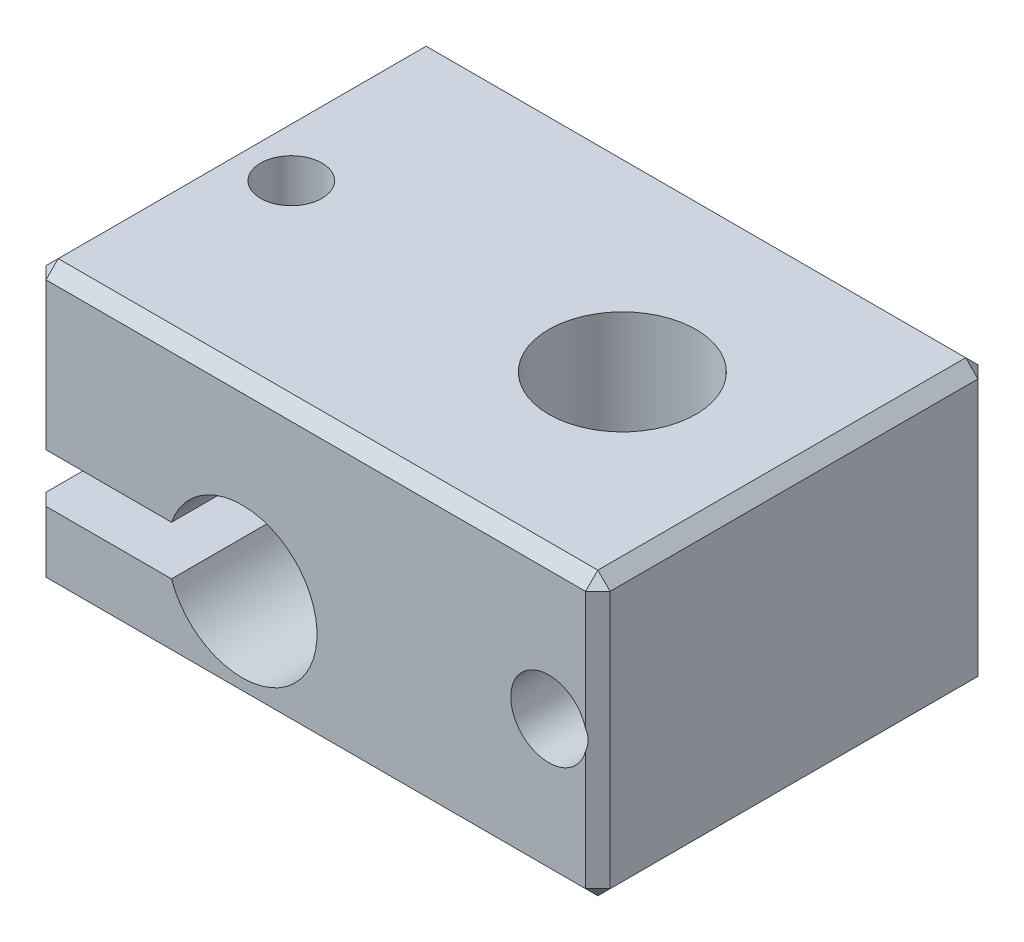
ISO-10303-21;
HEADER;
FILE_DESCRIPTION(('STEP AP214'),'2;1');
FILE_NAME('part.step','',(''),(''),'','','');
FILE_SCHEMA(('AUTOMOTIVE_DESIGN { 1 0 10303 214 1 1 1 1 }'));
ENDSEC;
DATA;
#1=APPLICATION_CONTEXT('core data for automotive mechanical design processes');
#2=APPLICATION_PROTOCOL_DEFINITION('international standard','automotive_design',2000,#1);
#3=PRODUCT_CONTEXT('',#1,'mechanical');
#4=PRODUCT('Part','Part','',(#3));
#5=PRODUCT_RELATED_PRODUCT_CATEGORY('part','',(#4));
#6=PRODUCT_DEFINITION_FORMATION('','',#4);
#7=PRODUCT_DEFINITION_CONTEXT('part definition',#1,'design');
#8=PRODUCT_DEFINITION('design','',#6,#7);
#9=PRODUCT_DEFINITION_SHAPE('','',#8);
#10=(LENGTH_UNIT() NAMED_UNIT(*) SI_UNIT(.MILLI.,.METRE.));
#11=(NAMED_UNIT(*) PLANE_ANGLE_UNIT() SI_UNIT($,.RADIAN.));
#12=(NAMED_UNIT(*) SI_UNIT($,.STERADIAN.) SOLID_ANGLE_UNIT());
#13=UNCERTAINTY_MEASURE_WITH_UNIT(LENGTH_MEASURE(1.E-05),#10,'distance_accuracy_value','');
#14=(GEOMETRIC_REPRESENTATION_CONTEXT(3) GLOBAL_UNCERTAINTY_ASSIGNED_CONTEXT((#13)) GLOBAL_UNIT_ASSIGNED_CONTEXT((#10,
#11,#12)) REPRESENTATION_CONTEXT('',''));
#15=CARTESIAN_POINT('',(0.,0.,0.));
#16=DIRECTION('',(0.,0.,1.));
#17=DIRECTION('',(1.,0.,0.));
#18=AXIS2_PLACEMENT_3D('',#15,#16,#17);
#19=CARTESIAN_POINT('',(-11.5,-5.75,8.));
#20=DIRECTION('',(0.,1.,0.));
#21=DIRECTION('',(0.,0.,1.));
#22=AXIS2_PLACEMENT_3D('',#19,#20,#21);
#23=PLANE('',#22);
#24=CARTESIAN_POINT('',(4.5,-5.75,0.));
#25=DIRECTION('',(0.,1.,0.));
#26=DIRECTION('',(0.,0.,1.));
#27=AXIS2_PLACEMENT_3D('',#24,#25,#26);
#28=CIRCLE('',#27,2.99999999999999);
#29=CARTESIAN_POINT('',(4.5,-5.75,2.99999999999999));
#30=VERTEX_POINT('',#29);
#31=EDGE_CURVE('E486',#30,#30,#28,.T.);
#32=ORIENTED_EDGE('',*,*,#31,.T.);
#33=EDGE_LOOP('',(#32));
#34=FACE_BOUND('',#33,.T.);
#35=CARTESIAN_POINT('',(-9.00000000000001,-5.75,0.));
#36=DIRECTION('',(0.,1.,0.));
#37=DIRECTION('',(0.,0.,1.));
#38=AXIS2_PLACEMENT_3D('',#35,#36,#37);
#39=CIRCLE('',#38,1.25);
#40=CARTESIAN_POINT('',(-9.00000000000001,-5.75,1.25));
#41=VERTEX_POINT('',#40);
#42=EDGE_CURVE('E491',#41,#41,#39,.T.);
#43=ORIENTED_EDGE('',*,*,#42,.T.);
#44=EDGE_LOOP('',(#43));
#45=FACE_BOUND('',#44,.T.);
#46=DIRECTION('',(0.,0.,-1.));
#47=VECTOR('',#46,1.);
#48=CARTESIAN_POINT('',(-11.,-5.75,8.));
#49=LINE('',#48,#47);
#50=CARTESIAN_POINT('',(-11.,-5.75,7.5));
#51=VERTEX_POINT('',#50);
#52=CARTESIAN_POINT('',(-11.,-5.75,-7.5));
#53=VERTEX_POINT('',#52);
#54=EDGE_CURVE('E347',#51,#53,#49,.T.);
#55=ORIENTED_EDGE('',*,*,#54,.T.);
#56=DIRECTION('',(1.,0.,0.));
#57=VECTOR('',#56,1.);
#58=CARTESIAN_POINT('',(11.5,-5.75,-7.5));
#59=LINE('',#58,#57);
#60=CARTESIAN_POINT('',(11.,-5.75,-7.5));
#61=VERTEX_POINT('',#60);
#62=EDGE_CURVE('E188',#53,#61,#59,.T.);
#63=ORIENTED_EDGE('',*,*,#62,.T.);
#64=DIRECTION('',(0.,0.,1.));
#65=VECTOR('',#64,1.);
#66=CARTESIAN_POINT('',(11.,-5.75,8.));
#67=LINE('',#66,#65);
#68=CARTESIAN_POINT('',(11.,-5.75,7.5));
#69=VERTEX_POINT('',#68);
#70=EDGE_CURVE('E343',#61,#69,#67,.T.);
#71=ORIENTED_EDGE('',*,*,#70,.T.);
#72=DIRECTION('',(-1.,0.,0.));
#73=VECTOR('',#72,1.);
#74=CARTESIAN_POINT('',(-11.5,-5.75,7.5));
#75=LINE('',#74,#73);
#76=EDGE_CURVE('E345',#69,#51,#75,.T.);
#77=ORIENTED_EDGE('',*,*,#76,.T.);
#78=EDGE_LOOP('',(#55,#63,#71,#77));
#79=FACE_BOUND('',#78,.T.);
#80=CARTESIAN_POINT('',(9.5,-5.75,0.));
#81=DIRECTION('',(0.,-1.,0.));
#82=DIRECTION('',(0.,0.,-1.));
#83=AXIS2_PLACEMENT_3D('',#80,#81,#82);
#84=CIRCLE('',#83,1.25);
#85=CARTESIAN_POINT('',(9.5,-5.75,-1.25));
#86=VERTEX_POINT('',#85);
#87=EDGE_CURVE('E480',#86,#86,#84,.T.);
#88=ORIENTED_EDGE('',*,*,#87,.F.);
#89=EDGE_LOOP('',(#88));
#90=FACE_BOUND('',#89,.T.);
#91=ADVANCED_FACE('F35',(#34,#45,#79,#90),#23,.F.);
#92=CARTESIAN_POINT('',(-3.,-1.75,8.));
#93=DIRECTION('',(0.,0.,-1.));
#94=DIRECTION('',(-1.,0.,0.));
#95=AXIS2_PLACEMENT_3D('',#92,#93,#94);
#96=PLANE('',#95);
#97=CARTESIAN_POINT('',(9.5,0.,8.));
#98=DIRECTION('',(0.,0.,1.));
#99=DIRECTION('',(1.,0.,0.));
#100=AXIS2_PLACEMENT_3D('',#97,#98,#99);
#101=CIRCLE('',#100,1.55);
#102=CARTESIAN_POINT('',(11.,0.390512483795322,8.));
#103=VERTEX_POINT('',#102);
#104=CARTESIAN_POINT('',(11.,-0.390512483795318,8.));
#105=VERTEX_POINT('',#104);
#106=EDGE_CURVE('E49',#103,#105,#101,.T.);
#107=ORIENTED_EDGE('',*,*,#106,.F.);
#108=DIRECTION('',(0.,1.,0.));
#109=VECTOR('',#108,1.);
#110=CARTESIAN_POINT('',(11.,-1.75,8.));
#111=LINE('',#110,#109);
#112=CARTESIAN_POINT('',(11.,5.25,8.));
#113=VERTEX_POINT('',#112);
#114=EDGE_CURVE('E219',#103,#113,#111,.T.);
#115=ORIENTED_EDGE('',*,*,#114,.T.);
#116=DIRECTION('',(-1.,0.,0.));
#117=VECTOR('',#116,1.);
#118=CARTESIAN_POINT('',(-3.,5.25,8.));
#119=LINE('',#118,#117);
#120=CARTESIAN_POINT('',(-11.,5.25,8.));
#121=VERTEX_POINT('',#120);
#122=EDGE_CURVE('E217',#113,#121,#119,.T.);
#123=ORIENTED_EDGE('',*,*,#122,.T.);
#124=DIRECTION('',(0.,-1.,0.));
#125=VECTOR('',#124,1.);
#126=CARTESIAN_POINT('',(-11.,-1.75,8.));
#127=LINE('',#126,#125);
#128=CARTESIAN_POINT('',(-11.,-0.750000000000001,8.));
#129=VERTEX_POINT('',#128);
#130=EDGE_CURVE('E223',#121,#129,#127,.T.);
#131=ORIENTED_EDGE('',*,*,#130,.T.);
#132=DIRECTION('',(1.,0.,0.));
#133=VECTOR('',#132,1.);
#134=CARTESIAN_POINT('',(-11.5,-0.750000000000001,8.));
#135=LINE('',#134,#133);
#136=CARTESIAN_POINT('',(-5.88140590684478,-0.750000000000001,8.));
#137=VERTEX_POINT('',#136);
#138=EDGE_CURVE('E331',#129,#137,#135,.T.);
#139=ORIENTED_EDGE('',*,*,#138,.T.);
#140=CARTESIAN_POINT('',(-3.,-1.75,8.));
#141=DIRECTION('',(0.,0.,-1.));
#142=DIRECTION('',(-1.,0.,0.));
#143=AXIS2_PLACEMENT_3D('',#140,#141,#142);
#144=CIRCLE('',#143,3.05);
#145=CARTESIAN_POINT('',(-5.88140590684478,-2.75,8.));
#146=VERTEX_POINT('',#145);
#147=EDGE_CURVE('E401',#137,#146,#144,.T.);
#148=ORIENTED_EDGE('',*,*,#147,.T.);
#149=DIRECTION('',(-1.,0.,0.));
#150=VECTOR('',#149,1.);
#151=CARTESIAN_POINT('',(-5.88140590684478,-2.75,8.));
#152=LINE('',#151,#150);
#153=CARTESIAN_POINT('',(-11.,-2.75,8.));
#154=VERTEX_POINT('',#153);
#155=EDGE_CURVE('E326',#146,#154,#152,.T.);
#156=ORIENTED_EDGE('',*,*,#155,.T.);
#157=DIRECTION('',(0.,-1.,0.));
#158=VECTOR('',#157,1.);
#159=CARTESIAN_POINT('',(-11.,-1.75,8.));
#160=LINE('',#159,#158);
#161=CARTESIAN_POINT('',(-11.,-5.25,8.));
#162=VERTEX_POINT('',#161);
#163=EDGE_CURVE('E227',#154,#162,#160,.T.);
#164=ORIENTED_EDGE('',*,*,#163,.T.);
#165=DIRECTION('',(1.,0.,0.));
#166=VECTOR('',#165,1.);
#167=CARTESIAN_POINT('',(-3.,-5.25,8.));
#168=LINE('',#167,#166);
#169=CARTESIAN_POINT('',(11.,-5.25,8.));
#170=VERTEX_POINT('',#169);
#171=EDGE_CURVE('E225',#162,#170,#168,.T.);
#172=ORIENTED_EDGE('',*,*,#171,.T.);
#173=EDGE_CURVE('E220',#170,#105,#111,.T.);
#174=ORIENTED_EDGE('',*,*,#173,.T.);
#175=EDGE_LOOP('',(#107,#115,#123,#131,#139,#148,#156,#164,#172,#174));
#176=FACE_BOUND('',#175,.T.);
#177=ADVANCED_FACE('F430',(#176),#96,.F.);
#178=CARTESIAN_POINT('',(11.5,-5.75,8.));
#179=DIRECTION('',(-1.,0.,0.));
#180=DIRECTION('',(0.,0.,1.));
#181=AXIS2_PLACEMENT_3D('',#178,#179,#180);
#182=PLANE('',#181);
#183=DIRECTION('',(0.,-1.,0.));
#184=VECTOR('',#183,1.);
#185=CARTESIAN_POINT('',(11.5,-5.75,7.5));
#186=LINE('',#185,#184);
#187=CARTESIAN_POINT('',(11.5,5.25,7.5));
#188=VERTEX_POINT('',#187);
#189=CARTESIAN_POINT('',(11.5,-5.25,7.5));
#190=VERTEX_POINT('',#189);
#191=EDGE_CURVE('E231',#188,#190,#186,.T.);
#192=ORIENTED_EDGE('',*,*,#191,.T.);
#193=DIRECTION('',(0.,0.,-1.));
#194=VECTOR('',#193,1.);
#195=CARTESIAN_POINT('',(11.5,-5.25,8.));
#196=LINE('',#195,#194);
#197=CARTESIAN_POINT('',(11.5,-5.25,-7.5));
#198=VERTEX_POINT('',#197);
#199=EDGE_CURVE('E235',#190,#198,#196,.T.);
#200=ORIENTED_EDGE('',*,*,#199,.T.);
#201=DIRECTION('',(0.,1.,0.));
#202=VECTOR('',#201,1.);
#203=CARTESIAN_POINT('',(11.5,5.75,-7.5));
#204=LINE('',#203,#202);
#205=CARTESIAN_POINT('',(11.5,5.25,-7.5));
#206=VERTEX_POINT('',#205);
#207=EDGE_CURVE('E233',#198,#206,#204,.T.);
#208=ORIENTED_EDGE('',*,*,#207,.T.);
#209=DIRECTION('',(0.,0.,1.));
#210=VECTOR('',#209,1.);
#211=CARTESIAN_POINT('',(11.5,5.25,8.));
#212=LINE('',#211,#210);
#213=EDGE_CURVE('E229',#206,#188,#212,.T.);
#214=ORIENTED_EDGE('',*,*,#213,.T.);
#215=EDGE_LOOP('',(#192,#200,#208,#214));
#216=FACE_BOUND('',#215,.T.);
#217=ADVANCED_FACE('F423',(#216),#182,.F.);
#218=CARTESIAN_POINT('',(-11.5,5.75,8.));
#219=DIRECTION('',(0.,-1.,0.));
#220=DIRECTION('',(0.,0.,-1.));
#221=AXIS2_PLACEMENT_3D('',#218,#219,#220);
#222=PLANE('',#221);
#223=CARTESIAN_POINT('',(4.5,5.75,0.));
#224=DIRECTION('',(0.,1.,0.));
#225=DIRECTION('',(0.,0.,1.));
#226=AXIS2_PLACEMENT_3D('',#223,#224,#225);
#227=CIRCLE('',#226,2.99999999999999);
#228=CARTESIAN_POINT('',(4.5,5.75,2.99999999999999));
#229=VERTEX_POINT('',#228);
#230=EDGE_CURVE('E483',#229,#229,#227,.T.);
#231=ORIENTED_EDGE('',*,*,#230,.F.);
#232=EDGE_LOOP('',(#231));
#233=FACE_BOUND('',#232,.T.);
#234=CARTESIAN_POINT('',(-9.00000000000001,5.75,0.));
#235=DIRECTION('',(0.,1.,0.));
#236=DIRECTION('',(0.,0.,1.));
#237=AXIS2_PLACEMENT_3D('',#234,#235,#236);
#238=CIRCLE('',#237,1.24999999999999);
#239=CARTESIAN_POINT('',(-9.00000000000001,5.75,1.24999999999999));
#240=VERTEX_POINT('',#239);
#241=EDGE_CURVE('E488',#240,#240,#238,.T.);
#242=ORIENTED_EDGE('',*,*,#241,.F.);
#243=EDGE_LOOP('',(#242));
#244=FACE_BOUND('',#243,.T.);
#245=DIRECTION('',(1.,0.,0.));
#246=VECTOR('',#245,1.);
#247=CARTESIAN_POINT('',(-11.5,5.75,7.5));
#248=LINE('',#247,#246);
#249=CARTESIAN_POINT('',(-11.,5.75,7.5));
#250=VERTEX_POINT('',#249);
#251=CARTESIAN_POINT('',(11.,5.75,7.5));
#252=VERTEX_POINT('',#251);
#253=EDGE_CURVE('E240',#250,#252,#248,.T.);
#254=ORIENTED_EDGE('',*,*,#253,.T.);
#255=DIRECTION('',(0.,0.,-1.));
#256=VECTOR('',#255,1.);
#257=CARTESIAN_POINT('',(11.,5.75,8.));
#258=LINE('',#257,#256);
#259=CARTESIAN_POINT('',(11.,5.75,-7.5));
#260=VERTEX_POINT('',#259);
#261=EDGE_CURVE('E43',#252,#260,#258,.T.);
#262=ORIENTED_EDGE('',*,*,#261,.T.);
#263=DIRECTION('',(-1.,0.,0.));
#264=VECTOR('',#263,1.);
#265=CARTESIAN_POINT('',(-11.5,5.75,-7.5));
#266=LINE('',#265,#264);
#267=CARTESIAN_POINT('',(-11.,5.75,-7.5));
#268=VERTEX_POINT('',#267);
#269=EDGE_CURVE('E242',#260,#268,#266,.T.);
#270=ORIENTED_EDGE('',*,*,#269,.T.);
#271=DIRECTION('',(0.,0.,1.));
#272=VECTOR('',#271,1.);
#273=CARTESIAN_POINT('',(-11.,5.75,8.));
#274=LINE('',#273,#272);
#275=EDGE_CURVE('E238',#268,#250,#274,.T.);
#276=ORIENTED_EDGE('',*,*,#275,.T.);
#277=EDGE_LOOP('',(#254,#262,#270,#276));
#278=FACE_BOUND('',#277,.T.);
#279=ADVANCED_FACE('F513',(#233,#244,#278),#222,.F.);
#280=CARTESIAN_POINT('',(-11.5,5.75,8.));
#281=DIRECTION('',(1.,0.,0.));
#282=DIRECTION('',(0.,0.,-1.));
#283=AXIS2_PLACEMENT_3D('',#280,#281,#282);
#284=PLANE('',#283);
#285=DIRECTION('',(0.,0.,-1.));
#286=VECTOR('',#285,1.);
#287=CARTESIAN_POINT('',(-11.5,5.25,8.));
#288=LINE('',#287,#286);
#289=CARTESIAN_POINT('',(-11.5,5.25,7.5));
#290=VERTEX_POINT('',#289);
#291=CARTESIAN_POINT('',(-11.5,5.25,-7.5));
#292=VERTEX_POINT('',#291);
#293=EDGE_CURVE('E207',#290,#292,#288,.T.);
#294=ORIENTED_EDGE('',*,*,#293,.T.);
#295=DIRECTION('',(0.,-1.,0.));
#296=VECTOR('',#295,1.);
#297=CARTESIAN_POINT('',(-11.5,-0.750000000000001,-7.5));
#298=LINE('',#297,#296);
#299=CARTESIAN_POINT('',(-11.5,-0.750000000000001,-7.5));
#300=VERTEX_POINT('',#299);
#301=EDGE_CURVE('E211',#292,#300,#298,.T.);
#302=ORIENTED_EDGE('',*,*,#301,.T.);
#303=DIRECTION('',(0.,0.,-1.));
#304=VECTOR('',#303,1.);
#305=CARTESIAN_POINT('',(-11.5,-0.750000000000001,8.));
#306=LINE('',#305,#304);
#307=CARTESIAN_POINT('',(-11.5,-0.750000000000001,7.5));
#308=VERTEX_POINT('',#307);
#309=EDGE_CURVE('E340',#308,#300,#306,.T.);
#310=ORIENTED_EDGE('',*,*,#309,.F.);
#311=DIRECTION('',(0.,1.,0.));
#312=VECTOR('',#311,1.);
#313=CARTESIAN_POINT('',(-11.5,5.75,7.5));
#314=LINE('',#313,#312);
#315=EDGE_CURVE('E209',#308,#290,#314,.T.);
#316=ORIENTED_EDGE('',*,*,#315,.T.);
#317=EDGE_LOOP('',(#294,#302,#310,#316));
#318=FACE_BOUND('',#317,.T.);
#319=ADVANCED_FACE('F505',(#318),#284,.F.);
#320=CARTESIAN_POINT('',(-11.5,-0.750000000000001,8.));
#321=DIRECTION('',(0.,1.,0.));
#322=DIRECTION('',(-1.,0.,0.));
#323=AXIS2_PLACEMENT_3D('',#320,#321,#322);
#324=PLANE('',#323);
#325=CARTESIAN_POINT('',(-9.00000000000001,-0.750000000000001,0.));
#326=DIRECTION('',(0.,1.,0.));
#327=DIRECTION('',(-1.,0.,0.));
#328=AXIS2_PLACEMENT_3D('',#325,#326,#327);
#329=CIRCLE('',#328,1.24999999999999);
#330=CARTESIAN_POINT('',(-10.25,-0.750000000000001,0.));
#331=VERTEX_POINT('',#330);
#332=EDGE_CURVE('E494',#331,#331,#329,.T.);
#333=ORIENTED_EDGE('',*,*,#332,.T.);
#334=EDGE_LOOP('',(#333));
#335=FACE_BOUND('',#334,.T.);
#336=ORIENTED_EDGE('',*,*,#309,.T.);
#337=DIRECTION('',(0.70710678118655,0.,-0.707106781186545));
#338=VECTOR('',#337,1.);
#339=CARTESIAN_POINT('',(-11.5,-0.750000000000001,-7.5));
#340=LINE('',#339,#338);
#341=CARTESIAN_POINT('',(-11.,-0.750000000000001,-8.));
#342=VERTEX_POINT('',#341);
#343=EDGE_CURVE('E215',#300,#342,#340,.T.);
#344=ORIENTED_EDGE('',*,*,#343,.T.);
#345=DIRECTION('',(1.,0.,0.));
#346=VECTOR('',#345,1.);
#347=CARTESIAN_POINT('',(-11.5,-0.750000000000001,-8.));
#348=LINE('',#347,#346);
#349=CARTESIAN_POINT('',(-5.88140590684478,-0.750000000000001,-8.));
#350=VERTEX_POINT('',#349);
#351=EDGE_CURVE('E312',#342,#350,#348,.T.);
#352=ORIENTED_EDGE('',*,*,#351,.T.);
#353=DIRECTION('',(0.,0.,-1.));
#354=VECTOR('',#353,1.);
#355=CARTESIAN_POINT('',(-5.88140590684478,-0.750000000000001,8.));
#356=LINE('',#355,#354);
#357=EDGE_CURVE('E338',#137,#350,#356,.T.);
#358=ORIENTED_EDGE('',*,*,#357,.F.);
#359=ORIENTED_EDGE('',*,*,#138,.F.);
#360=DIRECTION('',(0.70710678118655,0.,0.707106781186545));
#361=VECTOR('',#360,1.);
#362=CARTESIAN_POINT('',(-11.,-0.750000000000001,8.));
#363=LINE('',#362,#361);
#364=EDGE_CURVE('E213',#129,#308,#363,.F.);
#365=ORIENTED_EDGE('',*,*,#364,.T.);
#366=EDGE_LOOP('',(#336,#344,#352,#358,#359,#365));
#367=FACE_BOUND('',#366,.T.);
#368=ADVANCED_FACE('F502',(#335,#367),#324,.F.);
#369=CARTESIAN_POINT('',(-3.,-1.75,8.));
#370=DIRECTION('',(0.,0.,-1.));
#371=DIRECTION('',(-1.,0.,0.));
#372=AXIS2_PLACEMENT_3D('',#369,#370,#371);
#373=CYLINDRICAL_SURFACE('',#372,3.05);
#374=CARTESIAN_POINT('',(-3.,-1.75,-8.));
#375=DIRECTION('',(0.,0.,-1.));
#376=DIRECTION('',(-1.,0.,0.));
#377=AXIS2_PLACEMENT_3D('',#374,#375,#376);
#378=CIRCLE('',#377,3.05);
#379=CARTESIAN_POINT('',(-5.88140590684478,-2.75,-8.));
#380=VERTEX_POINT('',#379);
#381=EDGE_CURVE('E317',#350,#380,#378,.T.);
#382=ORIENTED_EDGE('',*,*,#381,.T.);
#383=DIRECTION('',(0.,0.,-1.));
#384=VECTOR('',#383,1.);
#385=CARTESIAN_POINT('',(-5.88140590684478,-2.75,8.));
#386=LINE('',#385,#384);
#387=EDGE_CURVE('E335',#146,#380,#386,.T.);
#388=ORIENTED_EDGE('',*,*,#387,.F.);
#389=ORIENTED_EDGE('',*,*,#147,.F.);
#390=ORIENTED_EDGE('',*,*,#357,.T.);
#391=EDGE_LOOP('',(#382,#388,#389,#390));
#392=FACE_BOUND('',#391,.T.);
#393=ADVANCED_FACE('F400',(#392),#373,.F.);
#394=CARTESIAN_POINT('',(-5.88140590684478,-2.75,8.));
#395=DIRECTION('',(0.,-1.,0.));
#396=DIRECTION('',(1.,0.,0.));
#397=AXIS2_PLACEMENT_3D('',#394,#395,#396);
#398=PLANE('',#397);
#399=CARTESIAN_POINT('',(-9.00000000000001,-2.75,0.));
#400=DIRECTION('',(0.,-1.,0.));
#401=DIRECTION('',(1.,0.,0.));
#402=AXIS2_PLACEMENT_3D('',#399,#400,#401);
#403=CIRCLE('',#402,1.24999999999999);
#404=CARTESIAN_POINT('',(-7.75000000000001,-2.75,0.));
#405=VERTEX_POINT('',#404);
#406=EDGE_CURVE('E249',#405,#405,#403,.T.);
#407=ORIENTED_EDGE('',*,*,#406,.T.);
#408=EDGE_LOOP('',(#407));
#409=FACE_BOUND('',#408,.T.);
#410=DIRECTION('',(-1.,0.,0.));
#411=VECTOR('',#410,1.);
#412=CARTESIAN_POINT('',(-5.88140590684478,-2.75,-8.));
#413=LINE('',#412,#411);
#414=CARTESIAN_POINT('',(-11.,-2.75,-8.));
#415=VERTEX_POINT('',#414);
#416=EDGE_CURVE('E323',#380,#415,#413,.T.);
#417=ORIENTED_EDGE('',*,*,#416,.T.);
#418=DIRECTION('',(-0.70710678118655,0.,0.707106781186545));
#419=VECTOR('',#418,1.);
#420=CARTESIAN_POINT('',(-11.5,-2.75,-7.5));
#421=LINE('',#420,#419);
#422=CARTESIAN_POINT('',(-11.5,-2.75,-7.5));
#423=VERTEX_POINT('',#422);
#424=EDGE_CURVE('E205',#415,#423,#421,.T.);
#425=ORIENTED_EDGE('',*,*,#424,.T.);
#426=DIRECTION('',(0.,0.,-1.));
#427=VECTOR('',#426,1.);
#428=CARTESIAN_POINT('',(-11.5,-2.75,8.));
#429=LINE('',#428,#427);
#430=CARTESIAN_POINT('',(-11.5,-2.75,7.5));
#431=VERTEX_POINT('',#430);
#432=EDGE_CURVE('E332',#431,#423,#429,.T.);
#433=ORIENTED_EDGE('',*,*,#432,.F.);
#434=DIRECTION('',(-0.707106781186545,0.,-0.70710678118655));
#435=VECTOR('',#434,1.);
#436=CARTESIAN_POINT('',(-11.,-2.75,8.));
#437=LINE('',#436,#435);
#438=EDGE_CURVE('E203',#431,#154,#437,.F.);
#439=ORIENTED_EDGE('',*,*,#438,.T.);
#440=ORIENTED_EDGE('',*,*,#155,.F.);
#441=ORIENTED_EDGE('',*,*,#387,.T.);
#442=EDGE_LOOP('',(#417,#425,#433,#439,#440,#441));
#443=FACE_BOUND('',#442,.T.);
#444=ADVANCED_FACE('F393',(#409,#443),#398,.F.);
#445=CARTESIAN_POINT('',(-11.5,-2.75,8.));
#446=DIRECTION('',(1.,0.,0.));
#447=DIRECTION('',(0.,0.,-1.));
#448=AXIS2_PLACEMENT_3D('',#445,#446,#447);
#449=PLANE('',#448);
#450=ORIENTED_EDGE('',*,*,#432,.T.);
#451=DIRECTION('',(0.,-1.,0.));
#452=VECTOR('',#451,1.);
#453=CARTESIAN_POINT('',(-11.5,-5.75,-7.5));
#454=LINE('',#453,#452);
#455=CARTESIAN_POINT('',(-11.5,-5.25,-7.5));
#456=VERTEX_POINT('',#455);
#457=EDGE_CURVE('E201',#423,#456,#454,.T.);
#458=ORIENTED_EDGE('',*,*,#457,.T.);
#459=DIRECTION('',(0.,0.,1.));
#460=VECTOR('',#459,1.);
#461=CARTESIAN_POINT('',(-11.5,-5.25,8.));
#462=LINE('',#461,#460);
#463=CARTESIAN_POINT('',(-11.5,-5.25,7.5));
#464=VERTEX_POINT('',#463);
#465=EDGE_CURVE('E199',#456,#464,#462,.T.);
#466=ORIENTED_EDGE('',*,*,#465,.T.);
#467=DIRECTION('',(0.,1.,0.));
#468=VECTOR('',#467,1.);
#469=CARTESIAN_POINT('',(-11.5,-2.75,7.5));
#470=LINE('',#469,#468);
#471=EDGE_CURVE('E197',#464,#431,#470,.T.);
#472=ORIENTED_EDGE('',*,*,#471,.T.);
#473=EDGE_LOOP('',(#450,#458,#466,#472));
#474=FACE_BOUND('',#473,.T.);
#475=ADVANCED_FACE('F437',(#474),#449,.F.);
#476=CARTESIAN_POINT('',(-3.,-1.75,-8.));
#477=DIRECTION('',(0.,0.,-1.));
#478=DIRECTION('',(-1.,0.,0.));
#479=AXIS2_PLACEMENT_3D('',#476,#477,#478);
#480=PLANE('',#479);
#481=CARTESIAN_POINT('',(9.5,0.,-8.));
#482=DIRECTION('',(0.,0.,1.));
#483=DIRECTION('',(1.,0.,0.));
#484=AXIS2_PLACEMENT_3D('',#481,#482,#483);
#485=CIRCLE('',#484,1.54999999999999);
#486=CARTESIAN_POINT('',(11.,0.390512483795326,-8.));
#487=VERTEX_POINT('',#486);
#488=CARTESIAN_POINT('',(11.,-0.390512483795322,-8.));
#489=VERTEX_POINT('',#488);
#490=EDGE_CURVE('E55',#487,#489,#485,.T.);
#491=ORIENTED_EDGE('',*,*,#490,.T.);
#492=DIRECTION('',(0.,-1.,0.));
#493=VECTOR('',#492,1.);
#494=CARTESIAN_POINT('',(11.,-5.75,-8.));
#495=LINE('',#494,#493);
#496=CARTESIAN_POINT('',(11.,-5.25,-8.));
#497=VERTEX_POINT('',#496);
#498=EDGE_CURVE('E176',#489,#497,#495,.T.);
#499=ORIENTED_EDGE('',*,*,#498,.T.);
#500=DIRECTION('',(-1.,0.,0.));
#501=VECTOR('',#500,1.);
#502=CARTESIAN_POINT('',(-11.5,-5.25,-8.));
#503=LINE('',#502,#501);
#504=CARTESIAN_POINT('',(-11.,-5.25,-8.));
#505=VERTEX_POINT('',#504);
#506=EDGE_CURVE('E193',#497,#505,#503,.T.);
#507=ORIENTED_EDGE('',*,*,#506,.T.);
#508=DIRECTION('',(0.,1.,0.));
#509=VECTOR('',#508,1.);
#510=CARTESIAN_POINT('',(-11.,-2.75,-8.));
#511=LINE('',#510,#509);
#512=EDGE_CURVE('E195',#505,#415,#511,.T.);
#513=ORIENTED_EDGE('',*,*,#512,.T.);
#514=ORIENTED_EDGE('',*,*,#416,.F.);
#515=ORIENTED_EDGE('',*,*,#381,.F.);
#516=ORIENTED_EDGE('',*,*,#351,.F.);
#517=DIRECTION('',(0.,1.,0.));
#518=VECTOR('',#517,1.);
#519=CARTESIAN_POINT('',(-11.,5.75,-8.));
#520=LINE('',#519,#518);
#521=CARTESIAN_POINT('',(-11.,5.25,-8.));
#522=VERTEX_POINT('',#521);
#523=EDGE_CURVE('E187',#342,#522,#520,.T.);
#524=ORIENTED_EDGE('',*,*,#523,.T.);
#525=DIRECTION('',(1.,0.,0.));
#526=VECTOR('',#525,1.);
#527=CARTESIAN_POINT('',(11.5,5.25,-8.));
#528=LINE('',#527,#526);
#529=CARTESIAN_POINT('',(11.,5.25,-8.));
#530=VERTEX_POINT('',#529);
#531=EDGE_CURVE('E185',#522,#530,#528,.T.);
#532=ORIENTED_EDGE('',*,*,#531,.T.);
#533=EDGE_CURVE('E178',#530,#487,#495,.T.);
#534=ORIENTED_EDGE('',*,*,#533,.T.);
#535=EDGE_LOOP('',(#491,#499,#507,#513,#514,#515,#516,#524,#532,#534));
#536=FACE_BOUND('',#535,.T.);
#537=ADVANCED_FACE('F174',(#536),#480,.T.);
#538=CARTESIAN_POINT('',(-11.,-1.75,8.));
#539=DIRECTION('',(0.707106781186545,0.,-0.70710678118655));
#540=DIRECTION('',(0.,-1.,0.));
#541=AXIS2_PLACEMENT_3D('',#538,#539,#540);
#542=PLANE('',#541);
#543=DIRECTION('',(-0.70710678118655,0.,-0.707106781186545));
#544=VECTOR('',#543,1.);
#545=CARTESIAN_POINT('',(-11.5,5.25,7.5));
#546=LINE('',#545,#544);
#547=EDGE_CURVE('E310',#290,#121,#546,.F.);
#548=ORIENTED_EDGE('',*,*,#547,.F.);
#549=ORIENTED_EDGE('',*,*,#315,.F.);
#550=ORIENTED_EDGE('',*,*,#364,.F.);
#551=ORIENTED_EDGE('',*,*,#130,.F.);
#552=EDGE_LOOP('',(#548,#549,#550,#551));
#553=FACE_BOUND('',#552,.T.);
#554=ADVANCED_FACE('F37',(#553),#542,.F.);
#555=CARTESIAN_POINT('',(-11.5,5.25,7.5));
#556=DIRECTION('',(-0.577350269189622,0.57735026918963,0.577350269189626));
#557=DIRECTION('',(0.,-0.707106781186545,0.70710678118655));
#558=AXIS2_PLACEMENT_3D('',#555,#556,#557);
#559=PLANE('',#558);
#560=DIRECTION('',(0.70710678118655,0.707106781186545,0.));
#561=VECTOR('',#560,1.);
#562=CARTESIAN_POINT('',(-11.5,5.25,7.5));
#563=LINE('',#562,#561);
#564=EDGE_CURVE('E305',#290,#250,#563,.T.);
#565=ORIENTED_EDGE('',*,*,#564,.F.);
#566=ORIENTED_EDGE('',*,*,#547,.T.);
#567=DIRECTION('',(0.,-0.707106781186545,0.70710678118655));
#568=VECTOR('',#567,1.);
#569=CARTESIAN_POINT('',(-11.,5.5,7.75));
#570=LINE('',#569,#568);
#571=EDGE_CURVE('E308',#250,#121,#570,.T.);
#572=ORIENTED_EDGE('',*,*,#571,.F.);
#573=EDGE_LOOP('',(#565,#566,#572));
#574=FACE_BOUND('',#573,.T.);
#575=ADVANCED_FACE('F568',(#574),#559,.T.);
#576=CARTESIAN_POINT('',(-3.,5.25,8.));
#577=DIRECTION('',(0.,-0.70710678118655,-0.707106781186545));
#578=DIRECTION('',(-1.,0.,0.));
#579=AXIS2_PLACEMENT_3D('',#576,#577,#578);
#580=PLANE('',#579);
#581=ORIENTED_EDGE('',*,*,#571,.T.);
#582=ORIENTED_EDGE('',*,*,#122,.F.);
#583=DIRECTION('',(0.,0.707106781186545,-0.70710678118655));
#584=VECTOR('',#583,1.);
#585=CARTESIAN_POINT('',(11.,5.25,8.));
#586=LINE('',#585,#584);
#587=EDGE_CURVE('E302',#252,#113,#586,.F.);
#588=ORIENTED_EDGE('',*,*,#587,.F.);
#589=ORIENTED_EDGE('',*,*,#253,.F.);
#590=EDGE_LOOP('',(#581,#582,#588,#589));
#591=FACE_BOUND('',#590,.T.);
#592=ADVANCED_FACE('F565',(#591),#580,.F.);
#593=CARTESIAN_POINT('',(-11.5,5.25,8.));
#594=DIRECTION('',(0.707106781186545,-0.70710678118655,0.));
#595=DIRECTION('',(0.,0.,-1.));
#596=AXIS2_PLACEMENT_3D('',#593,#594,#595);
#597=PLANE('',#596);
#598=ORIENTED_EDGE('',*,*,#564,.T.);
#599=ORIENTED_EDGE('',*,*,#275,.F.);
#600=DIRECTION('',(-0.70710678118655,-0.707106781186545,0.));
#601=VECTOR('',#600,1.);
#602=CARTESIAN_POINT('',(-11.25,5.5,-7.5));
#603=LINE('',#602,#601);
#604=EDGE_CURVE('E299',#292,#268,#603,.F.);
#605=ORIENTED_EDGE('',*,*,#604,.F.);
#606=ORIENTED_EDGE('',*,*,#293,.F.);
#607=EDGE_LOOP('',(#598,#599,#605,#606));
#608=FACE_BOUND('',#607,.T.);
#609=ADVANCED_FACE('F562',(#608),#597,.F.);
#610=CARTESIAN_POINT('',(-11.5,5.75,-7.5));
#611=DIRECTION('',(-0.707106781186545,0.,-0.70710678118655));
#612=DIRECTION('',(0.,1.,0.));
#613=AXIS2_PLACEMENT_3D('',#610,#611,#612);
#614=PLANE('',#613);
#615=ORIENTED_EDGE('',*,*,#343,.F.);
#616=ORIENTED_EDGE('',*,*,#301,.F.);
#617=DIRECTION('',(-0.70710678118655,0.,0.707106781186545));
#618=VECTOR('',#617,1.);
#619=CARTESIAN_POINT('',(-11.,5.25,-8.));
#620=LINE('',#619,#618);
#621=EDGE_CURVE('E296',#522,#292,#620,.T.);
#622=ORIENTED_EDGE('',*,*,#621,.F.);
#623=ORIENTED_EDGE('',*,*,#523,.F.);
#624=EDGE_LOOP('',(#615,#616,#622,#623));
#625=FACE_BOUND('',#624,.T.);
#626=ADVANCED_FACE('F406',(#625),#614,.T.);
#627=CARTESIAN_POINT('',(11.,5.25,8.));
#628=DIRECTION('',(0.577350269189626,0.57735026918963,0.577350269189622));
#629=DIRECTION('',(-0.70710678118655,0.707106781186545,0.));
#630=AXIS2_PLACEMENT_3D('',#627,#628,#629);
#631=PLANE('',#630);
#632=DIRECTION('',(0.70710678118655,-0.707106781186545,0.));
#633=VECTOR('',#632,1.);
#634=CARTESIAN_POINT('',(11.25,5.5,7.5));
#635=LINE('',#634,#633);
#636=EDGE_CURVE('E290',#252,#188,#635,.T.);
#637=ORIENTED_EDGE('',*,*,#636,.F.);
#638=ORIENTED_EDGE('',*,*,#587,.T.);
#639=DIRECTION('',(-0.707106781186545,0.,0.70710678118655));
#640=VECTOR('',#639,1.);
#641=CARTESIAN_POINT('',(11.,5.25,8.));
#642=LINE('',#641,#640);
#643=EDGE_CURVE('E293',#188,#113,#642,.T.);
#644=ORIENTED_EDGE('',*,*,#643,.F.);
#645=EDGE_LOOP('',(#637,#638,#644));
#646=FACE_BOUND('',#645,.T.);
#647=ADVANCED_FACE('F556',(#646),#631,.T.);
#648=CARTESIAN_POINT('',(-11.,5.25,-8.));
#649=DIRECTION('',(-0.577350269189622,0.57735026918963,-0.577350269189626));
#650=DIRECTION('',(0.,0.707106781186545,0.70710678118655));
#651=AXIS2_PLACEMENT_3D('',#648,#649,#650);
#652=PLANE('',#651);
#653=ORIENTED_EDGE('',*,*,#621,.T.);
#654=ORIENTED_EDGE('',*,*,#604,.T.);
#655=DIRECTION('',(0.,-0.707106781186545,-0.70710678118655));
#656=VECTOR('',#655,1.);
#657=CARTESIAN_POINT('',(-11.,5.25,-8.));
#658=LINE('',#657,#656);
#659=EDGE_CURVE('E287',#522,#268,#658,.F.);
#660=ORIENTED_EDGE('',*,*,#659,.F.);
#661=EDGE_LOOP('',(#653,#654,#660));
#662=FACE_BOUND('',#661,.T.);
#663=ADVANCED_FACE('F412',(#662),#652,.T.);
#664=CARTESIAN_POINT('',(-11.,-1.75,8.));
#665=DIRECTION('',(0.70710678118655,0.,-0.707106781186545));
#666=DIRECTION('',(0.,-1.,0.));
#667=AXIS2_PLACEMENT_3D('',#664,#665,#666);
#668=PLANE('',#667);
#669=ORIENTED_EDGE('',*,*,#438,.F.);
#670=ORIENTED_EDGE('',*,*,#471,.F.);
#671=DIRECTION('',(0.707106781186545,0.,0.70710678118655));
#672=VECTOR('',#671,1.);
#673=CARTESIAN_POINT('',(-11.5,-5.25,7.5));
#674=LINE('',#673,#672);
#675=EDGE_CURVE('E284',#162,#464,#674,.F.);
#676=ORIENTED_EDGE('',*,*,#675,.F.);
#677=ORIENTED_EDGE('',*,*,#163,.F.);
#678=EDGE_LOOP('',(#669,#670,#676,#677));
#679=FACE_BOUND('',#678,.T.);
#680=ADVANCED_FACE('F434',(#679),#668,.F.);
#681=CARTESIAN_POINT('',(-3.,-5.25,8.));
#682=DIRECTION('',(0.,0.70710678118655,-0.707106781186545));
#683=DIRECTION('',(1.,0.,0.));
#684=AXIS2_PLACEMENT_3D('',#681,#682,#683);
#685=PLANE('',#684);
#686=DIRECTION('',(0.,0.707106781186545,0.70710678118655));
#687=VECTOR('',#686,1.);
#688=CARTESIAN_POINT('',(11.,-5.25,8.));
#689=LINE('',#688,#687);
#690=EDGE_CURVE('E278',#170,#69,#689,.F.);
#691=ORIENTED_EDGE('',*,*,#690,.F.);
#692=ORIENTED_EDGE('',*,*,#171,.F.);
#693=DIRECTION('',(0.,-0.707106781186545,-0.70710678118655));
#694=VECTOR('',#693,1.);
#695=CARTESIAN_POINT('',(-11.,-5.5,7.75));
#696=LINE('',#695,#694);
#697=EDGE_CURVE('E281',#51,#162,#696,.F.);
#698=ORIENTED_EDGE('',*,*,#697,.F.);
#699=ORIENTED_EDGE('',*,*,#76,.F.);
#700=EDGE_LOOP('',(#691,#692,#698,#699));
#701=FACE_BOUND('',#700,.T.);
#702=ADVANCED_FACE('F373',(#701),#685,.F.);
#703=CARTESIAN_POINT('',(11.,-1.75,8.));
#704=DIRECTION('',(-0.70710678118655,0.,-0.707106781186545));
#705=DIRECTION('',(0.,1.,0.));
#706=AXIS2_PLACEMENT_3D('',#703,#704,#705);
#707=PLANE('',#706);
#708=CARTESIAN_POINT('',(9.5,0.,9.50000000000001));
#709=DIRECTION('',(-0.70710678118655,0.,-0.707106781186545));
#710=DIRECTION('',(-0.707106781186545,0.,0.70710678118655));
#711=AXIS2_PLACEMENT_3D('',#708,#709,#710);
#712=ELLIPSE('',#711,2.1920310216783,1.55);
#713=EDGE_CURVE('E179',#105,#103,#712,.F.);
#714=ORIENTED_EDGE('',*,*,#713,.F.);
#715=ORIENTED_EDGE('',*,*,#173,.F.);
#716=DIRECTION('',(0.707106781186545,0.,-0.70710678118655));
#717=VECTOR('',#716,1.);
#718=CARTESIAN_POINT('',(11.,-5.25,8.));
#719=LINE('',#718,#717);
#720=EDGE_CURVE('E275',#190,#170,#719,.F.);
#721=ORIENTED_EDGE('',*,*,#720,.F.);
#722=ORIENTED_EDGE('',*,*,#191,.F.);
#723=ORIENTED_EDGE('',*,*,#643,.T.);
#724=ORIENTED_EDGE('',*,*,#114,.F.);
#725=EDGE_LOOP('',(#714,#715,#721,#722,#723,#724));
#726=FACE_BOUND('',#725,.T.);
#727=ADVANCED_FACE('F427',(#726),#707,.F.);
#728=CARTESIAN_POINT('',(11.,5.75,8.));
#729=DIRECTION('',(-0.707106781186545,-0.70710678118655,0.));
#730=DIRECTION('',(0.,0.,-1.));
#731=AXIS2_PLACEMENT_3D('',#728,#729,#730);
#732=PLANE('',#731);
#733=ORIENTED_EDGE('',*,*,#636,.T.);
#734=ORIENTED_EDGE('',*,*,#213,.F.);
#735=DIRECTION('',(-0.70710678118655,0.707106781186545,0.));
#736=VECTOR('',#735,1.);
#737=CARTESIAN_POINT('',(11.5,5.25,-7.5));
#738=LINE('',#737,#736);
#739=EDGE_CURVE('E272',#260,#206,#738,.F.);
#740=ORIENTED_EDGE('',*,*,#739,.F.);
#741=ORIENTED_EDGE('',*,*,#261,.F.);
#742=EDGE_LOOP('',(#733,#734,#740,#741));
#743=FACE_BOUND('',#742,.T.);
#744=ADVANCED_FACE('F544',(#743),#732,.F.);
#745=CARTESIAN_POINT('',(-11.5,5.75,-7.5));
#746=DIRECTION('',(0.,0.70710678118655,-0.707106781186545));
#747=DIRECTION('',(1.,0.,0.));
#748=AXIS2_PLACEMENT_3D('',#745,#746,#747);
#749=PLANE('',#748);
#750=ORIENTED_EDGE('',*,*,#659,.T.);
#751=ORIENTED_EDGE('',*,*,#269,.F.);
#752=DIRECTION('',(0.,0.707106781186545,0.70710678118655));
#753=VECTOR('',#752,1.);
#754=CARTESIAN_POINT('',(11.,5.5,-7.75));
#755=LINE('',#754,#753);
#756=EDGE_CURVE('E270',#530,#260,#755,.T.);
#757=ORIENTED_EDGE('',*,*,#756,.F.);
#758=ORIENTED_EDGE('',*,*,#531,.F.);
#759=EDGE_LOOP('',(#750,#751,#757,#758));
#760=FACE_BOUND('',#759,.T.);
#761=ADVANCED_FACE('F416',(#760),#749,.T.);
#762=CARTESIAN_POINT('',(-11.5,-5.25,7.5));
#763=DIRECTION('',(-0.57735026918963,-0.577350269189626,0.577350269189622));
#764=DIRECTION('',(0.707106781186545,-0.70710678118655,0.));
#765=AXIS2_PLACEMENT_3D('',#762,#763,#764);
#766=PLANE('',#765);
#767=ORIENTED_EDGE('',*,*,#697,.T.);
#768=ORIENTED_EDGE('',*,*,#675,.T.);
#769=DIRECTION('',(-0.707106781186545,0.70710678118655,0.));
#770=VECTOR('',#769,1.);
#771=CARTESIAN_POINT('',(-11.5,-5.25,7.5));
#772=LINE('',#771,#770);
#773=EDGE_CURVE('E267',#51,#464,#772,.T.);
#774=ORIENTED_EDGE('',*,*,#773,.F.);
#775=EDGE_LOOP('',(#767,#768,#774));
#776=FACE_BOUND('',#775,.T.);
#777=ADVANCED_FACE('F378',(#776),#766,.T.);
#778=CARTESIAN_POINT('',(11.,-5.25,8.));
#779=DIRECTION('',(0.577350269189626,-0.57735026918963,0.577350269189622));
#780=DIRECTION('',(0.70710678118655,0.707106781186545,0.));
#781=AXIS2_PLACEMENT_3D('',#778,#779,#780);
#782=PLANE('',#781);
#783=ORIENTED_EDGE('',*,*,#720,.T.);
#784=ORIENTED_EDGE('',*,*,#690,.T.);
#785=DIRECTION('',(-0.70710678118655,-0.707106781186545,0.));
#786=VECTOR('',#785,1.);
#787=CARTESIAN_POINT('',(11.25,-5.5,7.5));
#788=LINE('',#787,#786);
#789=EDGE_CURVE('E264',#190,#69,#788,.T.);
#790=ORIENTED_EDGE('',*,*,#789,.F.);
#791=EDGE_LOOP('',(#783,#784,#790));
#792=FACE_BOUND('',#791,.T.);
#793=ADVANCED_FACE('F368',(#792),#782,.T.);
#794=CARTESIAN_POINT('',(11.5,5.25,-7.5));
#795=DIRECTION('',(0.577350269189622,0.57735026918963,-0.577350269189626));
#796=DIRECTION('',(0.,0.707106781186545,0.70710678118655));
#797=AXIS2_PLACEMENT_3D('',#794,#795,#796);
#798=PLANE('',#797);
#799=ORIENTED_EDGE('',*,*,#756,.T.);
#800=ORIENTED_EDGE('',*,*,#739,.T.);
#801=DIRECTION('',(-0.70710678118655,0.,-0.707106781186545));
#802=VECTOR('',#801,1.);
#803=CARTESIAN_POINT('',(11.5,5.25,-7.5));
#804=LINE('',#803,#802);
#805=EDGE_CURVE('E261',#530,#206,#804,.F.);
#806=ORIENTED_EDGE('',*,*,#805,.F.);
#807=EDGE_LOOP('',(#799,#800,#806));
#808=FACE_BOUND('',#807,.T.);
#809=ADVANCED_FACE('F420',(#808),#798,.T.);
#810=CARTESIAN_POINT('',(-11.5,-2.75,-7.5));
#811=DIRECTION('',(-0.707106781186545,0.,-0.70710678118655));
#812=DIRECTION('',(0.,1.,0.));
#813=AXIS2_PLACEMENT_3D('',#810,#811,#812);
#814=PLANE('',#813);
#815=ORIENTED_EDGE('',*,*,#424,.F.);
#816=ORIENTED_EDGE('',*,*,#512,.F.);
#817=DIRECTION('',(0.70710678118655,0.,-0.707106781186545));
#818=VECTOR('',#817,1.);
#819=CARTESIAN_POINT('',(-11.,-5.25,-8.));
#820=LINE('',#819,#818);
#821=EDGE_CURVE('E258',#456,#505,#820,.T.);
#822=ORIENTED_EDGE('',*,*,#821,.F.);
#823=ORIENTED_EDGE('',*,*,#457,.F.);
#824=EDGE_LOOP('',(#815,#816,#822,#823));
#825=FACE_BOUND('',#824,.T.);
#826=ADVANCED_FACE('F389',(#825),#814,.T.);
#827=CARTESIAN_POINT('',(-11.,-5.75,8.));
#828=DIRECTION('',(0.70710678118655,0.707106781186545,0.));
#829=DIRECTION('',(0.,0.,-1.));
#830=AXIS2_PLACEMENT_3D('',#827,#828,#829);
#831=PLANE('',#830);
#832=ORIENTED_EDGE('',*,*,#773,.T.);
#833=ORIENTED_EDGE('',*,*,#465,.F.);
#834=DIRECTION('',(0.707106781186545,-0.70710678118655,0.));
#835=VECTOR('',#834,1.);
#836=CARTESIAN_POINT('',(-11.25,-5.5,-7.5));
#837=LINE('',#836,#835);
#838=EDGE_CURVE('E255',#53,#456,#837,.F.);
#839=ORIENTED_EDGE('',*,*,#838,.F.);
#840=ORIENTED_EDGE('',*,*,#54,.F.);
#841=EDGE_LOOP('',(#832,#833,#839,#840));
#842=FACE_BOUND('',#841,.T.);
#843=ADVANCED_FACE('F381',(#842),#831,.F.);
#844=CARTESIAN_POINT('',(11.5,-5.25,8.));
#845=DIRECTION('',(-0.707106781186545,0.70710678118655,0.));
#846=DIRECTION('',(0.,0.,-1.));
#847=AXIS2_PLACEMENT_3D('',#844,#845,#846);
#848=PLANE('',#847);
#849=ORIENTED_EDGE('',*,*,#789,.T.);
#850=ORIENTED_EDGE('',*,*,#70,.F.);
#851=DIRECTION('',(0.70710678118655,0.707106781186545,0.));
#852=VECTOR('',#851,1.);
#853=CARTESIAN_POINT('',(11.,-5.75,-7.5));
#854=LINE('',#853,#852);
#855=EDGE_CURVE('E252',#198,#61,#854,.F.);
#856=ORIENTED_EDGE('',*,*,#855,.F.);
#857=ORIENTED_EDGE('',*,*,#199,.F.);
#858=EDGE_LOOP('',(#849,#850,#856,#857));
#859=FACE_BOUND('',#858,.T.);
#860=ADVANCED_FACE('F365',(#859),#848,.F.);
#861=CARTESIAN_POINT('',(11.5,-5.75,-7.5));
#862=DIRECTION('',(0.707106781186545,0.,-0.70710678118655));
#863=DIRECTION('',(0.,-1.,0.));
#864=AXIS2_PLACEMENT_3D('',#861,#862,#863);
#865=PLANE('',#864);
#866=CARTESIAN_POINT('',(9.5,0.,-9.49999999999999));
#867=DIRECTION('',(0.707106781186545,0.,-0.70710678118655));
#868=DIRECTION('',(0.70710678118655,0.,0.707106781186545));
#869=AXIS2_PLACEMENT_3D('',#866,#867,#868);
#870=ELLIPSE('',#869,2.19203102167828,1.55);
#871=EDGE_CURVE('E11',#487,#489,#870,.T.);
#872=ORIENTED_EDGE('',*,*,#871,.F.);
#873=ORIENTED_EDGE('',*,*,#533,.F.);
#874=ORIENTED_EDGE('',*,*,#805,.T.);
#875=ORIENTED_EDGE('',*,*,#207,.F.);
#876=DIRECTION('',(0.70710678118655,0.,0.707106781186545));
#877=VECTOR('',#876,1.);
#878=CARTESIAN_POINT('',(11.25,-5.25,-7.75));
#879=LINE('',#878,#877);
#880=EDGE_CURVE('E183',#497,#198,#879,.T.);
#881=ORIENTED_EDGE('',*,*,#880,.F.);
#882=ORIENTED_EDGE('',*,*,#498,.F.);
#883=EDGE_LOOP('',(#872,#873,#874,#875,#881,#882));
#884=FACE_BOUND('',#883,.T.);
#885=ADVANCED_FACE('F181',(#884),#865,.T.);
#886=CARTESIAN_POINT('',(-11.,-5.25,-8.));
#887=DIRECTION('',(-0.577350269189626,-0.577350269189622,-0.57735026918963));
#888=DIRECTION('',(-0.70710678118655,0.,0.707106781186545));
#889=AXIS2_PLACEMENT_3D('',#886,#887,#888);
#890=PLANE('',#889);
#891=ORIENTED_EDGE('',*,*,#838,.T.);
#892=ORIENTED_EDGE('',*,*,#821,.T.);
#893=DIRECTION('',(0.,-0.70710678118655,0.707106781186545));
#894=VECTOR('',#893,1.);
#895=CARTESIAN_POINT('',(-11.,-5.25,-8.));
#896=LINE('',#895,#894);
#897=EDGE_CURVE('E248',#53,#505,#896,.F.);
#898=ORIENTED_EDGE('',*,*,#897,.F.);
#899=EDGE_LOOP('',(#891,#892,#898));
#900=FACE_BOUND('',#899,.T.);
#901=ADVANCED_FACE('F384',(#900),#890,.T.);
#902=CARTESIAN_POINT('',(11.,-5.75,-7.5));
#903=DIRECTION('',(0.577350269189622,-0.577350269189626,-0.57735026918963));
#904=DIRECTION('',(0.,0.70710678118655,-0.707106781186545));
#905=AXIS2_PLACEMENT_3D('',#902,#903,#904);
#906=PLANE('',#905);
#907=ORIENTED_EDGE('',*,*,#880,.T.);
#908=ORIENTED_EDGE('',*,*,#855,.T.);
#909=DIRECTION('',(0.,0.70710678118655,-0.707106781186545));
#910=VECTOR('',#909,1.);
#911=CARTESIAN_POINT('',(11.,-5.75,-7.5));
#912=LINE('',#911,#910);
#913=EDGE_CURVE('E246',#497,#61,#912,.F.);
#914=ORIENTED_EDGE('',*,*,#913,.F.);
#915=EDGE_LOOP('',(#907,#908,#914));
#916=FACE_BOUND('',#915,.T.);
#917=ADVANCED_FACE('F362',(#916),#906,.T.);
#918=CARTESIAN_POINT('',(-11.5,-5.75,-7.5));
#919=DIRECTION('',(0.,-0.707106781186545,-0.70710678118655));
#920=DIRECTION('',(-1.,0.,0.));
#921=AXIS2_PLACEMENT_3D('',#918,#919,#920);
#922=PLANE('',#921);
#923=ORIENTED_EDGE('',*,*,#897,.T.);
#924=ORIENTED_EDGE('',*,*,#506,.F.);
#925=ORIENTED_EDGE('',*,*,#913,.T.);
#926=ORIENTED_EDGE('',*,*,#62,.F.);
#927=EDGE_LOOP('',(#923,#924,#925,#926));
#928=FACE_BOUND('',#927,.T.);
#929=ADVANCED_FACE('F357',(#928),#922,.T.);
#930=CARTESIAN_POINT('',(-9.00000000000001,5.75,0.));
#931=DIRECTION('',(0.,1.,0.));
#932=DIRECTION('',(0.,0.,1.));
#933=AXIS2_PLACEMENT_3D('',#930,#931,#932);
#934=CYLINDRICAL_SURFACE('',#933,1.24999999999999);
#935=ORIENTED_EDGE('',*,*,#42,.F.);
#936=EDGE_LOOP('',(#935));
#937=FACE_BOUND('',#936,.T.);
#938=ORIENTED_EDGE('',*,*,#406,.F.);
#939=EDGE_LOOP('',(#938));
#940=FACE_BOUND('',#939,.T.);
#941=ADVANCED_FACE('F457',(#937,#940),#934,.F.);
#942=ORIENTED_EDGE('',*,*,#241,.T.);
#943=EDGE_LOOP('',(#942));
#944=FACE_BOUND('',#943,.T.);
#945=ORIENTED_EDGE('',*,*,#332,.F.);
#946=EDGE_LOOP('',(#945));
#947=FACE_BOUND('',#946,.T.);
#948=ADVANCED_FACE('F460',(#944,#947),#934,.F.);
#949=CARTESIAN_POINT('',(4.5,5.75,0.));
#950=DIRECTION('',(0.,1.,0.));
#951=DIRECTION('',(0.,0.,1.));
#952=AXIS2_PLACEMENT_3D('',#949,#950,#951);
#953=CYLINDRICAL_SURFACE('',#952,2.99999999999999);
#954=ORIENTED_EDGE('',*,*,#31,.F.);
#955=EDGE_LOOP('',(#954));
#956=FACE_BOUND('',#955,.T.);
#957=ORIENTED_EDGE('',*,*,#230,.T.);
#958=EDGE_LOOP('',(#957));
#959=FACE_BOUND('',#958,.T.);
#960=ADVANCED_FACE('F462',(#956,#959),#953,.F.);
#961=CARTESIAN_POINT('',(9.5,0.,8.));
#962=DIRECTION('',(0.,0.,1.));
#963=DIRECTION('',(1.,0.,0.));
#964=AXIS2_PLACEMENT_3D('',#961,#962,#963);
#965=CYLINDRICAL_SURFACE('',#964,1.55);
#966=CARTESIAN_POINT('',(9.5,-1.55,-1.25));
#967=CARTESIAN_POINT('',(9.55988928099089,-1.54999505953035,-1.24999491939106));
#968=CARTESIAN_POINT('',(9.61984481473912,-1.54649449353117,-1.24566130338992));
#969=CARTESIAN_POINT('',(9.73780883514286,-1.53280476443067,-1.22862322249723));
#970=CARTESIAN_POINT('',(9.79581377070606,-1.52260403043149,-1.21590427636456));
#971=CARTESIAN_POINT('',(9.90786525492271,-1.49647462705166,-1.18301963709916));
#972=CARTESIAN_POINT('',(9.96193400040928,-1.48058165445635,-1.1629003318482));
#973=CARTESIAN_POINT('',(10.0654950318761,-1.44420715596625,-1.11622002150019));
#974=CARTESIAN_POINT('',(10.1149867430684,-1.42372505486709,-1.08965820886057));
#975=CARTESIAN_POINT('',(10.2254535915895,-1.37154799488092,-1.02069741739476));
#976=CARTESIAN_POINT('',(10.2843376032748,-1.33844407130946,-0.97601500214458));
#977=CARTESIAN_POINT('',(10.3925143949093,-1.2688854899676,-0.87821461772594));
#978=CARTESIAN_POINT('',(10.4417788955574,-1.23242140316721,-0.825072586325919));
#979=CARTESIAN_POINT('',(10.5311676485552,-1.15870438902471,-0.710337352806576));
#980=CARTESIAN_POINT('',(10.5711301918294,-1.12144827814354,-0.648620744872851));
#981=CARTESIAN_POINT('',(10.6403077996914,-1.05100245223139,-0.517373303517675));
#982=CARTESIAN_POINT('',(10.6695581057008,-1.0177996473176,-0.447869093806093));
#983=CARTESIAN_POINT('',(10.7057720399277,-0.974191674362003,-0.332463715497446));
#984=CARTESIAN_POINT('',(10.7169094735222,-0.960124893873719,-0.289278199728386));
#985=CARTESIAN_POINT('',(10.734610614028,-0.937254683932728,-0.200670057392794));
#986=CARTESIAN_POINT('',(10.7411856736356,-0.928438197825681,-0.155253286991567));
#987=CARTESIAN_POINT('',(10.7492963489852,-0.917503139557988,-0.0626901691861236));
#988=CARTESIAN_POINT('',(10.75078441298,-0.915447775064851,-0.0155316449096094));
#989=CARTESIAN_POINT('',(10.7484246653357,-0.91866072212832,0.0784123959376406));
#990=CARTESIAN_POINT('',(10.7445729314499,-0.923934417112574,0.125197612906793));
#991=CARTESIAN_POINT('',(10.7309972258897,-0.941957596134758,0.223512506959922));
#992=CARTESIAN_POINT('',(10.7205038602474,-0.955678817317825,0.274748505660733));
#993=CARTESIAN_POINT('',(10.6938885766394,-0.988725756600459,0.373872524094649));
#994=CARTESIAN_POINT('',(10.6777496322926,-1.00806839802359,0.421749884210686));
#995=CARTESIAN_POINT('',(10.6310094406375,-1.06070572623624,0.537564612040103));
#996=CARTESIAN_POINT('',(10.5972315313788,-1.09608098010003,0.603260006632807));
#997=CARTESIAN_POINT('',(10.5194331392835,-1.16880990951978,0.727052240002089));
#998=CARTESIAN_POINT('',(10.4753970332117,-1.20616653499972,0.785137275224793));
#999=CARTESIAN_POINT('',(10.3758099163534,-1.28040472376248,0.895052457884344));
#1000=CARTESIAN_POINT('',(10.3199481575349,-1.31723688801656,0.946637233479197));
#1001=CARTESIAN_POINT('',(10.1978506617392,-1.38577751282475,1.03988910513875));
#1002=CARTESIAN_POINT('',(10.1316427829299,-1.41749928091644,1.08158209805519));
#1003=CARTESIAN_POINT('',(10.0098977173949,-1.46474707386756,1.14269044564161));
#1004=CARTESIAN_POINT('',(9.95664087657561,-1.4823160847474,1.16507133834712));
#1005=CARTESIAN_POINT('',(9.84614958439182,-1.51193298467063,1.20252818181064));
#1006=CARTESIAN_POINT('',(9.78891812596194,-1.52398497727425,1.21760956242861));
#1007=CARTESIAN_POINT('',(9.67157045150231,-1.54162268594997,1.23961455198698));
#1008=CARTESIAN_POINT('',(9.6114399190763,-1.54717194073946,1.24649216567881));
#1009=CARTESIAN_POINT('',(9.49058372580549,-1.55114876216377,1.25142520240248));
#1010=CARTESIAN_POINT('',(9.42985822165416,-1.54957815613482,1.24948288909803));
#1011=CARTESIAN_POINT('',(9.31520391727594,-1.53992554933874,1.23748986080134));
#1012=CARTESIAN_POINT('',(9.26114606907761,-1.53242661712228,1.22816511589809));
#1013=CARTESIAN_POINT('',(9.15564023751843,-1.51221815510165,1.20285561393918));
#1014=CARTESIAN_POINT('',(9.10419297457458,-1.49950719568009,1.18686902957462));
#1015=CARTESIAN_POINT('',(9.00220864782947,-1.46890820831292,1.14797367430535));
#1016=CARTESIAN_POINT('',(8.95187109664531,-1.45077748295283,1.12473744786646));
#1017=CARTESIAN_POINT('',(8.85585652265305,-1.41077569163576,1.07264430581039));
#1018=CARTESIAN_POINT('',(8.81017991767241,-1.38890429081785,1.04378688695842));
#1019=CARTESIAN_POINT('',(8.71571133169262,-1.33819786080361,0.975396903044854));
#1020=CARTESIAN_POINT('',(8.66792547327749,-1.30882471485253,0.934877139389175));
#1021=CARTESIAN_POINT('',(8.57938117719974,-1.24813951208407,0.847835977717232));
#1022=CARTESIAN_POINT('',(8.53864122992833,-1.21682263818445,0.801299332103781));
#1023=CARTESIAN_POINT('',(8.45619599354744,-1.14737529170474,0.691856605933855));
#1024=CARTESIAN_POINT('',(8.4162555252007,-1.10926377626067,0.627602930328987));
#1025=CARTESIAN_POINT('',(8.34784316206073,-1.03800087709492,0.490764407929849));
#1026=CARTESIAN_POINT('',(8.3193310685618,-1.0048323699776,0.418209937609243));
#1027=CARTESIAN_POINT('',(8.28571561350617,-0.963523635601286,0.299802272964118));
#1028=CARTESIAN_POINT('',(8.27586915513713,-0.950872637087859,0.256899097774024));
#1029=CARTESIAN_POINT('',(8.26069773884303,-0.931014002821124,0.169125984831329));
#1030=CARTESIAN_POINT('',(8.25536070912434,-0.923791839774918,0.124261638388793));
#1031=CARTESIAN_POINT('',(8.24960747725349,-0.915995192552333,0.03327021983178));
#1032=CARTESIAN_POINT('',(8.24922820900016,-0.915470604055176,-0.0128637668324977));
#1033=CARTESIAN_POINT('',(8.25352704570419,-0.921311547881199,-0.104476324593386));
#1034=CARTESIAN_POINT('',(8.25821149056777,-0.927685717649252,-0.149954001654309));
#1035=CARTESIAN_POINT('',(8.27370067120152,-0.948093105879922,-0.248335448896977));
#1036=CARTESIAN_POINT('',(8.28558871873906,-0.963459182709492,-0.300780030663607));
#1037=CARTESIAN_POINT('',(8.31522767770658,-0.999680656158823,-0.402013055166403));
#1038=CARTESIAN_POINT('',(8.33299621214847,-1.02055251422295,-0.450789960492425));
#1039=CARTESIAN_POINT('',(8.38383860393261,-1.07643894670563,-0.567939183442154));
#1040=CARTESIAN_POINT('',(8.42013092923421,-1.11332890776578,-0.63401081039698));
#1041=CARTESIAN_POINT('',(8.50339098544154,-1.18846144459805,-0.758195623660045));
#1042=CARTESIAN_POINT('',(8.55037332918581,-1.22670581079814,-0.816297740062842));
#1043=CARTESIAN_POINT('',(8.65599750121512,-1.30171201314046,-0.925223731624032));
#1044=CARTESIAN_POINT('',(8.71487528835368,-1.3384219979948,-0.975857113502763));
#1045=CARTESIAN_POINT('',(8.84326376698778,-1.40585152676,-1.0664546204415));
#1046=CARTESIAN_POINT('',(8.91274464373939,-1.43658733490327,-1.10644782535871));
#1047=CARTESIAN_POINT('',(9.03812765210983,-1.48058708062424,-1.16290276103568));
#1048=CARTESIAN_POINT('',(9.09162003225322,-1.49631659405097,-1.18281824127779));
#1049=CARTESIAN_POINT('',(9.20203248652381,-1.52213886041912,-1.21532131262746));
#1050=CARTESIAN_POINT('',(9.25894429125975,-1.53224465020891,-1.22792585475975));
#1051=CARTESIAN_POINT('',(9.34696746672645,-1.54272840748517,-1.2409741730474));
#1052=CARTESIAN_POINT('',(9.37740239437531,-1.54544727545071,-1.24435088038918));
#1053=CARTESIAN_POINT('',(9.4385523526711,-1.54908457043243,-1.24886538482913));
#1054=CARTESIAN_POINT('',(9.46926745319506,-1.55000253523188,-1.25000260714521));
#1055=CARTESIAN_POINT('',(9.5,-1.55,-1.25));
#1056=B_SPLINE_CURVE_WITH_KNOTS('',3,(#966,#967,#968,#969,#970,#971,#972,#973,#974,#975,#976,
#977,#978,#979,#980,#981,#982,#983,#984,#985,#986,#987,#988,#989,#990,#991,#992,#993,#994,#995,
#996,#997,#998,#999,#1000,#1001,#1002,#1003,#1004,#1005,#1006,#1007,#1008,#1009,#1010,#1011,
#1012,#1013,#1014,#1015,#1016,#1017,#1018,#1019,#1020,#1021,#1022,#1023,#1024,#1025,#1026,#1027,
#1028,#1029,#1030,#1031,#1032,#1033,#1034,#1035,#1036,#1037,#1038,#1039,#1040,#1041,#1042,#1043,
#1044,#1045,#1046,#1047,#1048,#1049,#1050,#1051,#1052,#1053,#1054,#1055),.UNSPECIFIED.,.T.,.F.,
(4,2,2,2,2,2,2,2,2,2,2,2,2,2,2,2,2,2,2,2,2,2,2,2,2,2,2,2,2,2,2,2,2,2,2,2,2,2,2,2,2,2,2,2,4),(0.,
0.179535311511328,0.359381490753362,0.538119030068411,0.716878985009284,0.958570636850731,
1.20096245267447,1.44729699706568,1.69281370429634,1.83266576288545,1.97216856312847,
2.11297188092435,2.25387867792391,2.41518443643973,2.57698092846958,2.82140413865396,
3.06620206772523,3.3184804239741,3.57009083754105,3.75051776685534,3.93081027562208,
4.11210893141241,4.29336105892795,4.4587189973841,4.62412232257376,4.79846616240427,
4.97282561746981,5.17968312904776,5.38707551495262,5.64015999393783,5.89234628053384,
6.02928614815349,6.16585825407622,6.30344720806224,6.44120862689031,6.60805388422728,
6.77540375142227,7.02587593947767,7.27669259242034,7.53308453039105,7.78876837221908,
7.96569484430802,8.14220944055814,8.23431543497631,8.32644506607008),.UNSPECIFIED.);
#1057=CARTESIAN_POINT('',(9.5,-1.55,-1.25));
#1058=VERTEX_POINT('',#1057);
#1059=EDGE_CURVE('E474',#1058,#1058,#1056,.T.);
#1060=ORIENTED_EDGE('',*,*,#1059,.T.);
#1061=EDGE_LOOP('',(#1060));
#1062=FACE_BOUND('',#1061,.T.);
#1063=ORIENTED_EDGE('',*,*,#713,.T.);
#1064=ORIENTED_EDGE('',*,*,#106,.T.);
#1065=EDGE_LOOP('',(#1063,#1064));
#1066=FACE_BOUND('',#1065,.T.);
#1067=ORIENTED_EDGE('',*,*,#871,.T.);
#1068=ORIENTED_EDGE('',*,*,#490,.F.);
#1069=EDGE_LOOP('',(#1067,#1068));
#1070=FACE_BOUND('',#1069,.T.);
#1071=ADVANCED_FACE('F168',(#1062,#1066,#1070),#965,.F.);
#1072=CARTESIAN_POINT('',(9.5,-5.75,0.));
#1073=DIRECTION('',(0.,-1.,0.));
#1074=DIRECTION('',(0.,0.,-1.));
#1075=AXIS2_PLACEMENT_3D('',#1072,#1073,#1074);
#1076=CYLINDRICAL_SURFACE('',#1075,1.25);
#1077=ORIENTED_EDGE('',*,*,#1059,.F.);
#1078=EDGE_LOOP('',(#1077));
#1079=FACE_BOUND('',#1078,.T.);
#1080=ORIENTED_EDGE('',*,*,#87,.T.);
#1081=EDGE_LOOP('',(#1080));
#1082=FACE_BOUND('',#1081,.T.);
#1083=ADVANCED_FACE('F468',(#1079,#1082),#1076,.F.);
#1084=CLOSED_SHELL('',(#91,#177,#217,#279,#319,#368,#393,#444,#475,#537,#554,#575,#592,#609,
#626,#647,#663,#680,#702,#727,#744,#761,#777,#793,#809,#826,#843,#860,#885,#901,#917,#929,#941,
#948,#960,#1071,#1083));
#1085=MANIFOLD_SOLID_BREP('B2',#1084);
#1086=ADVANCED_BREP_SHAPE_REPRESENTATION('',(#18,#1085),#14);
#1087=SHAPE_DEFINITION_REPRESENTATION(#9,#1086);
ENDSEC;
END-ISO-10303-21;
